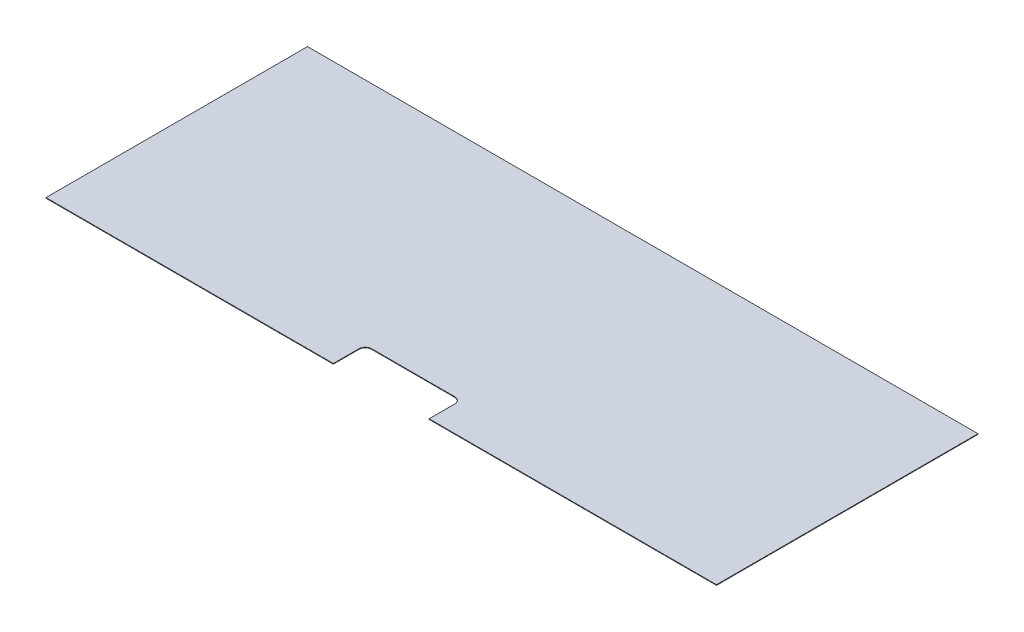
ISO-10303-21;
HEADER;
FILE_DESCRIPTION(('STEP AP214'),'2;1');
FILE_NAME('part.step','',(''),(''),'','','');
FILE_SCHEMA(('AUTOMOTIVE_DESIGN { 1 0 10303 214 1 1 1 1 }'));
ENDSEC;
DATA;
#1=APPLICATION_CONTEXT('core data for automotive mechanical design processes');
#2=APPLICATION_PROTOCOL_DEFINITION('international standard','automotive_design',2000,#1);
#3=PRODUCT_CONTEXT('',#1,'mechanical');
#4=PRODUCT('Part','Part','',(#3));
#5=PRODUCT_RELATED_PRODUCT_CATEGORY('part','',(#4));
#6=PRODUCT_DEFINITION_FORMATION('','',#4);
#7=PRODUCT_DEFINITION_CONTEXT('part definition',#1,'design');
#8=PRODUCT_DEFINITION('design','',#6,#7);
#9=PRODUCT_DEFINITION_SHAPE('','',#8);
#10=(LENGTH_UNIT() NAMED_UNIT(*) SI_UNIT(.MILLI.,.METRE.));
#11=(NAMED_UNIT(*) PLANE_ANGLE_UNIT() SI_UNIT($,.RADIAN.));
#12=(NAMED_UNIT(*) SI_UNIT($,.STERADIAN.) SOLID_ANGLE_UNIT());
#13=UNCERTAINTY_MEASURE_WITH_UNIT(LENGTH_MEASURE(1.E-05),#10,'distance_accuracy_value','');
#14=(GEOMETRIC_REPRESENTATION_CONTEXT(3) GLOBAL_UNCERTAINTY_ASSIGNED_CONTEXT((#13)) GLOBAL_UNIT_ASSIGNED_CONTEXT((#10,
#11,#12)) REPRESENTATION_CONTEXT('',''));
#15=CARTESIAN_POINT('',(0.,0.,0.));
#16=DIRECTION('',(0.,0.,1.));
#17=DIRECTION('',(1.,0.,0.));
#18=AXIS2_PLACEMENT_3D('',#15,#16,#17);
#19=CARTESIAN_POINT('',(506.090115825168,1.,-123.705718826228));
#20=DIRECTION('',(0.,0.,-1.));
#21=DIRECTION('',(-1.,0.,0.));
#22=AXIS2_PLACEMENT_3D('',#19,#20,#21);
#23=PLANE('',#22);
#24=DIRECTION('',(1.,0.,0.));
#25=VECTOR('',#24,1.);
#26=CARTESIAN_POINT('',(506.090115825168,0.,-123.705718826228));
#27=LINE('',#26,#25);
#28=CARTESIAN_POINT('',(-543.909884174832,0.,-123.705718826228));
#29=VERTEX_POINT('',#28);
#30=CARTESIAN_POINT('',(-93.9098841748315,0.,-123.705718826228));
#31=VERTEX_POINT('',#30);
#32=EDGE_CURVE('E113',#29,#31,#27,.T.);
#33=ORIENTED_EDGE('',*,*,#32,.T.);
#34=DIRECTION('',(0.,1.,0.));
#35=VECTOR('',#34,1.);
#36=CARTESIAN_POINT('',(-93.9098841748315,0.,-123.705718826228));
#37=LINE('',#36,#35);
#38=CARTESIAN_POINT('',(-93.9098841748315,1.,-123.705718826228));
#39=VERTEX_POINT('',#38);
#40=EDGE_CURVE('E119',#31,#39,#37,.T.);
#41=ORIENTED_EDGE('',*,*,#40,.T.);
#42=DIRECTION('',(1.,0.,0.));
#43=VECTOR('',#42,1.);
#44=CARTESIAN_POINT('',(506.090115825168,1.,-123.705718826228));
#45=LINE('',#44,#43);
#46=CARTESIAN_POINT('',(-543.909884174832,1.,-123.705718826228));
#47=VERTEX_POINT('',#46);
#48=EDGE_CURVE('E145',#47,#39,#45,.T.);
#49=ORIENTED_EDGE('',*,*,#48,.F.);
#50=DIRECTION('',(0.,-1.,0.));
#51=VECTOR('',#50,1.);
#52=CARTESIAN_POINT('',(-543.909884174832,1.,-123.705718826228));
#53=LINE('',#52,#51);
#54=EDGE_CURVE('E131',#47,#29,#53,.T.);
#55=ORIENTED_EDGE('',*,*,#54,.T.);
#56=EDGE_LOOP('',(#33,#41,#49,#55));
#57=FACE_BOUND('',#56,.T.);
#58=ADVANCED_FACE('F33',(#57),#23,.F.);
#59=CARTESIAN_POINT('',(506.090115825168,1.,-123.705718826228));
#60=DIRECTION('',(-1.,0.,0.));
#61=DIRECTION('',(0.,0.,1.));
#62=AXIS2_PLACEMENT_3D('',#59,#60,#61);
#63=PLANE('',#62);
#64=DIRECTION('',(0.,0.,-1.));
#65=VECTOR('',#64,1.);
#66=CARTESIAN_POINT('',(506.090115825168,0.,-123.705718826228));
#67=LINE('',#66,#65);
#68=CARTESIAN_POINT('',(506.090115825168,0.,-123.705718826228));
#69=VERTEX_POINT('',#68);
#70=CARTESIAN_POINT('',(506.090115825168,0.,-533.205718826228));
#71=VERTEX_POINT('',#70);
#72=EDGE_CURVE('E215',#69,#71,#67,.T.);
#73=ORIENTED_EDGE('',*,*,#72,.T.);
#74=DIRECTION('',(0.,-1.,0.));
#75=VECTOR('',#74,1.);
#76=CARTESIAN_POINT('',(506.090115825168,1.,-533.205718826228));
#77=LINE('',#76,#75);
#78=CARTESIAN_POINT('',(506.090115825168,1.,-533.205718826228));
#79=VERTEX_POINT('',#78);
#80=EDGE_CURVE('E150',#79,#71,#77,.T.);
#81=ORIENTED_EDGE('',*,*,#80,.F.);
#82=DIRECTION('',(0.,0.,-1.));
#83=VECTOR('',#82,1.);
#84=CARTESIAN_POINT('',(506.090115825168,1.,-123.705718826228));
#85=LINE('',#84,#83);
#86=CARTESIAN_POINT('',(506.090115825168,1.,-123.705718826228));
#87=VERTEX_POINT('',#86);
#88=EDGE_CURVE('E132',#87,#79,#85,.T.);
#89=ORIENTED_EDGE('',*,*,#88,.F.);
#90=DIRECTION('',(0.,-1.,0.));
#91=VECTOR('',#90,1.);
#92=CARTESIAN_POINT('',(506.090115825168,1.,-123.705718826228));
#93=LINE('',#92,#91);
#94=EDGE_CURVE('E142',#87,#69,#93,.T.);
#95=ORIENTED_EDGE('',*,*,#94,.T.);
#96=EDGE_LOOP('',(#73,#81,#89,#95));
#97=FACE_BOUND('',#96,.T.);
#98=ADVANCED_FACE('F183',(#97),#63,.F.);
#99=CARTESIAN_POINT('',(506.090115825168,1.,-533.205718826228));
#100=DIRECTION('',(0.,0.,1.));
#101=DIRECTION('',(1.,0.,0.));
#102=AXIS2_PLACEMENT_3D('',#99,#100,#101);
#103=PLANE('',#102);
#104=DIRECTION('',(-1.,0.,0.));
#105=VECTOR('',#104,1.);
#106=CARTESIAN_POINT('',(506.090115825168,0.,-533.205718826228));
#107=LINE('',#106,#105);
#108=CARTESIAN_POINT('',(-543.909884174831,0.,-533.205718826228));
#109=VERTEX_POINT('',#108);
#110=EDGE_CURVE('E217',#71,#109,#107,.T.);
#111=ORIENTED_EDGE('',*,*,#110,.T.);
#112=DIRECTION('',(0.,-1.,0.));
#113=VECTOR('',#112,1.);
#114=CARTESIAN_POINT('',(-543.909884174831,1.,-533.205718826228));
#115=LINE('',#114,#113);
#116=CARTESIAN_POINT('',(-543.909884174831,1.,-533.205718826228));
#117=VERTEX_POINT('',#116);
#118=EDGE_CURVE('E147',#117,#109,#115,.T.);
#119=ORIENTED_EDGE('',*,*,#118,.F.);
#120=DIRECTION('',(-1.,0.,0.));
#121=VECTOR('',#120,1.);
#122=CARTESIAN_POINT('',(506.090115825168,1.,-533.205718826228));
#123=LINE('',#122,#121);
#124=EDGE_CURVE('E136',#79,#117,#123,.T.);
#125=ORIENTED_EDGE('',*,*,#124,.F.);
#126=ORIENTED_EDGE('',*,*,#80,.T.);
#127=EDGE_LOOP('',(#111,#119,#125,#126));
#128=FACE_BOUND('',#127,.T.);
#129=ADVANCED_FACE('F189',(#128),#103,.F.);
#130=CARTESIAN_POINT('',(-543.909884174832,1.,-123.705718826228));
#131=DIRECTION('',(1.,0.,0.));
#132=DIRECTION('',(0.,0.,-1.));
#133=AXIS2_PLACEMENT_3D('',#130,#131,#132);
#134=PLANE('',#133);
#135=DIRECTION('',(0.,0.,1.));
#136=VECTOR('',#135,1.);
#137=CARTESIAN_POINT('',(-543.909884174832,0.,-123.705718826228));
#138=LINE('',#137,#136);
#139=EDGE_CURVE('E138',#109,#29,#138,.T.);
#140=ORIENTED_EDGE('',*,*,#139,.T.);
#141=ORIENTED_EDGE('',*,*,#54,.F.);
#142=DIRECTION('',(0.,0.,1.));
#143=VECTOR('',#142,1.);
#144=CARTESIAN_POINT('',(-543.909884174832,1.,-123.705718826228));
#145=LINE('',#144,#143);
#146=EDGE_CURVE('E210',#117,#47,#145,.T.);
#147=ORIENTED_EDGE('',*,*,#146,.F.);
#148=ORIENTED_EDGE('',*,*,#118,.T.);
#149=EDGE_LOOP('',(#140,#141,#147,#148));
#150=FACE_BOUND('',#149,.T.);
#151=ADVANCED_FACE('F195',(#150),#134,.F.);
#152=CARTESIAN_POINT('',(56.0901158251685,1.,-123.705718826228));
#153=VERTEX_POINT('',#152);
#154=EDGE_CURVE('E206',#153,#87,#45,.T.);
#155=ORIENTED_EDGE('',*,*,#154,.F.);
#156=DIRECTION('',(0.,1.,0.));
#157=VECTOR('',#156,1.);
#158=CARTESIAN_POINT('',(56.0901158251685,0.,-123.705718826228));
#159=LINE('',#158,#157);
#160=CARTESIAN_POINT('',(56.0901158251685,0.,-123.705718826228));
#161=VERTEX_POINT('',#160);
#162=EDGE_CURVE('E126',#161,#153,#159,.T.);
#163=ORIENTED_EDGE('',*,*,#162,.F.);
#164=EDGE_CURVE('E133',#161,#69,#27,.T.);
#165=ORIENTED_EDGE('',*,*,#164,.T.);
#166=ORIENTED_EDGE('',*,*,#94,.F.);
#167=EDGE_LOOP('',(#155,#163,#165,#166));
#168=FACE_BOUND('',#167,.T.);
#169=ADVANCED_FACE('F185',(#168),#23,.F.);
#170=CARTESIAN_POINT('',(0.,1.,0.));
#171=DIRECTION('',(0.,1.,0.));
#172=DIRECTION('',(0.,0.,1.));
#173=AXIS2_PLACEMENT_3D('',#170,#171,#172);
#174=PLANE('',#173);
#175=DIRECTION('',(0.,0.,1.));
#176=VECTOR('',#175,1.);
#177=CARTESIAN_POINT('',(-93.9098841748315,1.,-123.705718826228));
#178=LINE('',#177,#176);
#179=CARTESIAN_POINT('',(-93.9098841748315,1.,-163.705718826228));
#180=VERTEX_POINT('',#179);
#181=EDGE_CURVE('E122',#180,#39,#178,.T.);
#182=ORIENTED_EDGE('',*,*,#181,.F.);
#183=CARTESIAN_POINT('',(-83.9098841748315,1.,-163.705718826228));
#184=DIRECTION('',(0.,1.,0.));
#185=DIRECTION('',(0.,0.,1.));
#186=AXIS2_PLACEMENT_3D('',#183,#184,#185);
#187=CIRCLE('',#186,10.);
#188=CARTESIAN_POINT('',(-83.9098841748315,1.,-173.705718826228));
#189=VERTEX_POINT('',#188);
#190=EDGE_CURVE('E41',#180,#189,#187,.F.);
#191=ORIENTED_EDGE('',*,*,#190,.T.);
#192=DIRECTION('',(-1.,0.,0.));
#193=VECTOR('',#192,1.);
#194=CARTESIAN_POINT('',(-93.9098841748315,1.,-173.705718826228));
#195=LINE('',#194,#193);
#196=CARTESIAN_POINT('',(46.0901158251685,1.,-173.705718826228));
#197=VERTEX_POINT('',#196);
#198=EDGE_CURVE('E116',#197,#189,#195,.T.);
#199=ORIENTED_EDGE('',*,*,#198,.F.);
#200=CARTESIAN_POINT('',(46.0901158251685,1.,-163.705718826228));
#201=DIRECTION('',(0.,1.,0.));
#202=DIRECTION('',(0.,0.,1.));
#203=AXIS2_PLACEMENT_3D('',#200,#201,#202);
#204=CIRCLE('',#203,10.);
#205=CARTESIAN_POINT('',(56.0901158251685,1.,-163.705718826228));
#206=VERTEX_POINT('',#205);
#207=EDGE_CURVE('E162',#197,#206,#204,.F.);
#208=ORIENTED_EDGE('',*,*,#207,.T.);
#209=DIRECTION('',(0.,0.,-1.));
#210=VECTOR('',#209,1.);
#211=CARTESIAN_POINT('',(56.0901158251685,1.,-123.705718826228));
#212=LINE('',#211,#210);
#213=EDGE_CURVE('E173',#153,#206,#212,.T.);
#214=ORIENTED_EDGE('',*,*,#213,.F.);
#215=ORIENTED_EDGE('',*,*,#154,.T.);
#216=ORIENTED_EDGE('',*,*,#88,.T.);
#217=ORIENTED_EDGE('',*,*,#124,.T.);
#218=ORIENTED_EDGE('',*,*,#146,.T.);
#219=ORIENTED_EDGE('',*,*,#48,.T.);
#220=EDGE_LOOP('',(#182,#191,#199,#208,#214,#215,#216,#217,#218,#219));
#221=FACE_BOUND('',#220,.T.);
#222=ADVANCED_FACE('F168',(#221),#174,.T.);
#223=CARTESIAN_POINT('',(0.,0.,0.));
#224=DIRECTION('',(0.,1.,0.));
#225=DIRECTION('',(0.,0.,1.));
#226=AXIS2_PLACEMENT_3D('',#223,#224,#225);
#227=PLANE('',#226);
#228=DIRECTION('',(0.,0.,-1.));
#229=VECTOR('',#228,1.);
#230=CARTESIAN_POINT('',(56.0901158251685,0.,-123.705718826228));
#231=LINE('',#230,#229);
#232=CARTESIAN_POINT('',(56.0901158251685,0.,-163.705718826228));
#233=VERTEX_POINT('',#232);
#234=EDGE_CURVE('E115',#161,#233,#231,.T.);
#235=ORIENTED_EDGE('',*,*,#234,.T.);
#236=CARTESIAN_POINT('',(46.0901158251685,0.,-163.705718826228));
#237=DIRECTION('',(0.,1.,0.));
#238=DIRECTION('',(0.,0.,1.));
#239=AXIS2_PLACEMENT_3D('',#236,#237,#238);
#240=CIRCLE('',#239,10.);
#241=CARTESIAN_POINT('',(46.0901158251685,0.,-173.705718826228));
#242=VERTEX_POINT('',#241);
#243=EDGE_CURVE('E164',#233,#242,#240,.T.);
#244=ORIENTED_EDGE('',*,*,#243,.T.);
#245=DIRECTION('',(-1.,0.,0.));
#246=VECTOR('',#245,1.);
#247=CARTESIAN_POINT('',(-93.9098841748315,0.,-173.705718826228));
#248=LINE('',#247,#246);
#249=CARTESIAN_POINT('',(-83.9098841748315,0.,-173.705718826228));
#250=VERTEX_POINT('',#249);
#251=EDGE_CURVE('E127',#242,#250,#248,.T.);
#252=ORIENTED_EDGE('',*,*,#251,.T.);
#253=CARTESIAN_POINT('',(-83.9098841748315,0.,-163.705718826228));
#254=DIRECTION('',(0.,1.,0.));
#255=DIRECTION('',(0.,0.,1.));
#256=AXIS2_PLACEMENT_3D('',#253,#254,#255);
#257=CIRCLE('',#256,10.);
#258=CARTESIAN_POINT('',(-93.9098841748315,0.,-163.705718826228));
#259=VERTEX_POINT('',#258);
#260=EDGE_CURVE('E11',#250,#259,#257,.T.);
#261=ORIENTED_EDGE('',*,*,#260,.T.);
#262=DIRECTION('',(0.,0.,1.));
#263=VECTOR('',#262,1.);
#264=CARTESIAN_POINT('',(-93.9098841748315,0.,-123.705718826228));
#265=LINE('',#264,#263);
#266=EDGE_CURVE('E107',#259,#31,#265,.T.);
#267=ORIENTED_EDGE('',*,*,#266,.T.);
#268=ORIENTED_EDGE('',*,*,#32,.F.);
#269=ORIENTED_EDGE('',*,*,#139,.F.);
#270=ORIENTED_EDGE('',*,*,#110,.F.);
#271=ORIENTED_EDGE('',*,*,#72,.F.);
#272=ORIENTED_EDGE('',*,*,#164,.F.);
#273=EDGE_LOOP('',(#235,#244,#252,#261,#267,#268,#269,#270,#271,#272));
#274=FACE_BOUND('',#273,.T.);
#275=ADVANCED_FACE('F110',(#274),#227,.F.);
#276=CARTESIAN_POINT('',(-93.9098841748315,0.,-123.705718826228));
#277=DIRECTION('',(-1.,0.,0.));
#278=DIRECTION('',(0.,0.,1.));
#279=AXIS2_PLACEMENT_3D('',#276,#277,#278);
#280=PLANE('',#279);
#281=ORIENTED_EDGE('',*,*,#266,.F.);
#282=DIRECTION('',(0.,1.,0.));
#283=VECTOR('',#282,1.);
#284=CARTESIAN_POINT('',(-93.9098841748315,1.,-163.705718826228));
#285=LINE('',#284,#283);
#286=EDGE_CURVE('E160',#259,#180,#285,.T.);
#287=ORIENTED_EDGE('',*,*,#286,.T.);
#288=ORIENTED_EDGE('',*,*,#181,.T.);
#289=ORIENTED_EDGE('',*,*,#40,.F.);
#290=EDGE_LOOP('',(#281,#287,#288,#289));
#291=FACE_BOUND('',#290,.T.);
#292=ADVANCED_FACE('F120',(#291),#280,.F.);
#293=CARTESIAN_POINT('',(-93.9098841748315,0.,-173.705718826228));
#294=DIRECTION('',(0.,0.,-1.));
#295=DIRECTION('',(-1.,0.,0.));
#296=AXIS2_PLACEMENT_3D('',#293,#294,#295);
#297=PLANE('',#296);
#298=ORIENTED_EDGE('',*,*,#251,.F.);
#299=DIRECTION('',(0.,1.,0.));
#300=VECTOR('',#299,1.);
#301=CARTESIAN_POINT('',(46.0901158251685,1.,-173.705718826228));
#302=LINE('',#301,#300);
#303=EDGE_CURVE('E155',#242,#197,#302,.T.);
#304=ORIENTED_EDGE('',*,*,#303,.T.);
#305=ORIENTED_EDGE('',*,*,#198,.T.);
#306=DIRECTION('',(0.,1.,0.));
#307=VECTOR('',#306,1.);
#308=CARTESIAN_POINT('',(-83.9098841748315,0.,-173.705718826228));
#309=LINE('',#308,#307);
#310=EDGE_CURVE('E153',#189,#250,#309,.F.);
#311=ORIENTED_EDGE('',*,*,#310,.T.);
#312=EDGE_LOOP('',(#298,#304,#305,#311));
#313=FACE_BOUND('',#312,.T.);
#314=ADVANCED_FACE('F171',(#313),#297,.F.);
#315=CARTESIAN_POINT('',(56.0901158251685,0.,-123.705718826228));
#316=DIRECTION('',(1.,0.,0.));
#317=DIRECTION('',(0.,0.,-1.));
#318=AXIS2_PLACEMENT_3D('',#315,#316,#317);
#319=PLANE('',#318);
#320=ORIENTED_EDGE('',*,*,#213,.T.);
#321=DIRECTION('',(0.,1.,0.));
#322=VECTOR('',#321,1.);
#323=CARTESIAN_POINT('',(56.0901158251685,0.,-163.705718826228));
#324=LINE('',#323,#322);
#325=EDGE_CURVE('E158',#206,#233,#324,.F.);
#326=ORIENTED_EDGE('',*,*,#325,.T.);
#327=ORIENTED_EDGE('',*,*,#234,.F.);
#328=ORIENTED_EDGE('',*,*,#162,.T.);
#329=EDGE_LOOP('',(#320,#326,#327,#328));
#330=FACE_BOUND('',#329,.T.);
#331=ADVANCED_FACE('F180',(#330),#319,.F.);
#332=CARTESIAN_POINT('',(46.0901158251685,0.,-163.705718826228));
#333=DIRECTION('',(0.,-1.,0.));
#334=DIRECTION('',(0.,0.,-1.));
#335=AXIS2_PLACEMENT_3D('',#332,#333,#334);
#336=CYLINDRICAL_SURFACE('',#335,10.);
#337=ORIENTED_EDGE('',*,*,#243,.F.);
#338=ORIENTED_EDGE('',*,*,#325,.F.);
#339=ORIENTED_EDGE('',*,*,#207,.F.);
#340=ORIENTED_EDGE('',*,*,#303,.F.);
#341=EDGE_LOOP('',(#337,#338,#339,#340));
#342=FACE_BOUND('',#341,.T.);
#343=ADVANCED_FACE('F176',(#342),#336,.F.);
#344=CARTESIAN_POINT('',(-83.9098841748315,0.,-163.705718826228));
#345=DIRECTION('',(0.,-1.,0.));
#346=DIRECTION('',(0.,0.,-1.));
#347=AXIS2_PLACEMENT_3D('',#344,#345,#346);
#348=CYLINDRICAL_SURFACE('',#347,10.);
#349=ORIENTED_EDGE('',*,*,#260,.F.);
#350=ORIENTED_EDGE('',*,*,#310,.F.);
#351=ORIENTED_EDGE('',*,*,#190,.F.);
#352=ORIENTED_EDGE('',*,*,#286,.F.);
#353=EDGE_LOOP('',(#349,#350,#351,#352));
#354=FACE_BOUND('',#353,.T.);
#355=ADVANCED_FACE('F35',(#354),#348,.F.);
#356=CLOSED_SHELL('',(#58,#98,#129,#151,#169,#222,#275,#292,#314,#331,#343,#355));
#357=MANIFOLD_SOLID_BREP('B2',#356);
#358=ADVANCED_BREP_SHAPE_REPRESENTATION('',(#18,#357),#14);
#359=SHAPE_DEFINITION_REPRESENTATION(#9,#358);
ENDSEC;
END-ISO-10303-21;
